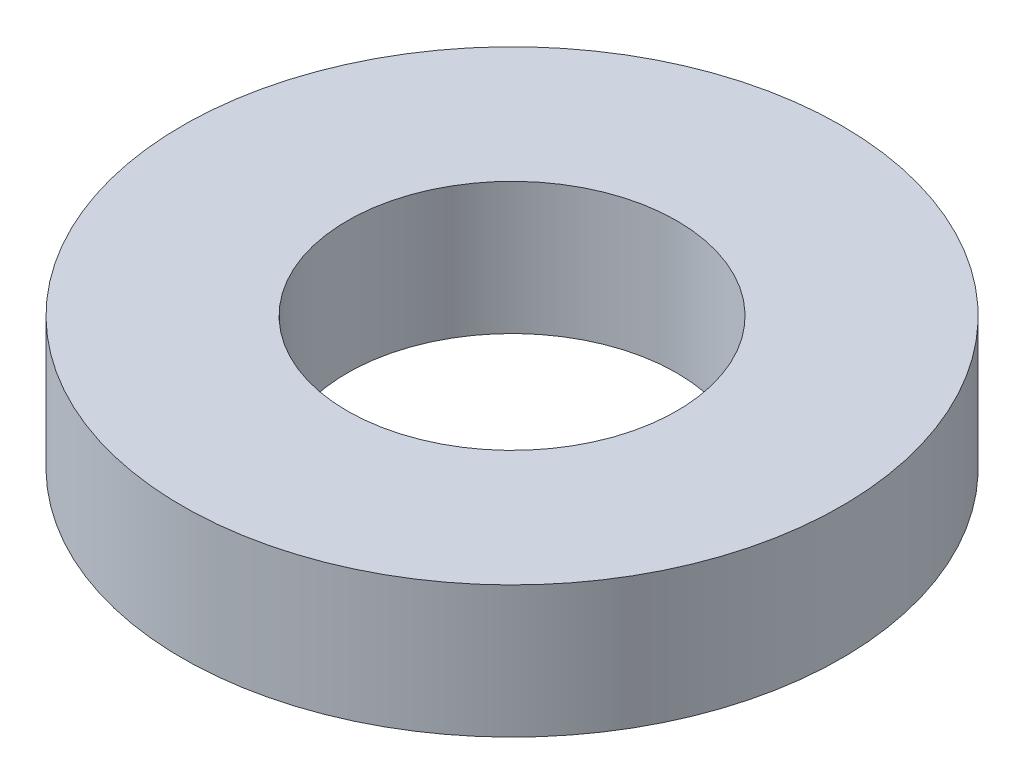
ISO-10303-21;
HEADER;
FILE_DESCRIPTION(('STEP AP214'),'2;1');
FILE_NAME('part.step','',(''),(''),'','','');
FILE_SCHEMA(('AUTOMOTIVE_DESIGN { 1 0 10303 214 1 1 1 1 }'));
ENDSEC;
DATA;
#1=APPLICATION_CONTEXT('core data for automotive mechanical design processes');
#2=APPLICATION_PROTOCOL_DEFINITION('international standard','automotive_design',2000,#1);
#3=PRODUCT_CONTEXT('',#1,'mechanical');
#4=PRODUCT('Part','Part','',(#3));
#5=PRODUCT_RELATED_PRODUCT_CATEGORY('part','',(#4));
#6=PRODUCT_DEFINITION_FORMATION('','',#4);
#7=PRODUCT_DEFINITION_CONTEXT('part definition',#1,'design');
#8=PRODUCT_DEFINITION('design','',#6,#7);
#9=PRODUCT_DEFINITION_SHAPE('','',#8);
#10=(LENGTH_UNIT() NAMED_UNIT(*) SI_UNIT(.MILLI.,.METRE.));
#11=(NAMED_UNIT(*) PLANE_ANGLE_UNIT() SI_UNIT($,.RADIAN.));
#12=(NAMED_UNIT(*) SI_UNIT($,.STERADIAN.) SOLID_ANGLE_UNIT());
#13=UNCERTAINTY_MEASURE_WITH_UNIT(LENGTH_MEASURE(1.E-05),#10,'distance_accuracy_value','');
#14=(GEOMETRIC_REPRESENTATION_CONTEXT(3) GLOBAL_UNCERTAINTY_ASSIGNED_CONTEXT((#13)) GLOBAL_UNIT_ASSIGNED_CONTEXT((#10,
#11,#12)) REPRESENTATION_CONTEXT('',''));
#15=CARTESIAN_POINT('',(0.,0.,0.));
#16=DIRECTION('',(0.,0.,1.));
#17=DIRECTION('',(1.,0.,0.));
#18=AXIS2_PLACEMENT_3D('',#15,#16,#17);
#19=CARTESIAN_POINT('',(0.,0.,0.));
#20=DIRECTION('',(0.,-1.,0.));
#21=DIRECTION('',(0.,0.,-1.));
#22=AXIS2_PLACEMENT_3D('',#19,#20,#21);
#23=CYLINDRICAL_SURFACE('',#22,5.);
#24=CARTESIAN_POINT('',(0.,0.999999999999999,0.));
#25=DIRECTION('',(0.,-1.,0.));
#26=DIRECTION('',(0.,0.,-1.));
#27=AXIS2_PLACEMENT_3D('',#24,#25,#26);
#28=CIRCLE('',#27,5.);
#29=CARTESIAN_POINT('',(0.,0.999999999999999,-5.));
#30=VERTEX_POINT('',#29);
#31=EDGE_CURVE('E10',#30,#30,#28,.T.);
#32=ORIENTED_EDGE('',*,*,#31,.T.);
#33=EDGE_LOOP('',(#32));
#34=FACE_BOUND('',#33,.T.);
#35=CARTESIAN_POINT('',(0.,-1.,0.));
#36=DIRECTION('',(0.,-1.,0.));
#37=DIRECTION('',(0.,0.,-1.));
#38=AXIS2_PLACEMENT_3D('',#35,#36,#37);
#39=CIRCLE('',#38,5.);
#40=CARTESIAN_POINT('',(0.,-1.,-5.));
#41=VERTEX_POINT('',#40);
#42=EDGE_CURVE('E45',#41,#41,#39,.T.);
#43=ORIENTED_EDGE('',*,*,#42,.F.);
#44=EDGE_LOOP('',(#43));
#45=FACE_BOUND('',#44,.T.);
#46=ADVANCED_FACE('F31',(#34,#45),#23,.T.);
#47=CARTESIAN_POINT('',(2.5,0.999999999999999,0.));
#48=DIRECTION('',(0.,1.,0.));
#49=DIRECTION('',(0.,0.,1.));
#50=AXIS2_PLACEMENT_3D('',#47,#48,#49);
#51=PLANE('',#50);
#52=CARTESIAN_POINT('',(0.,1.,0.));
#53=DIRECTION('',(0.,-1.,0.));
#54=DIRECTION('',(0.,0.,-1.));
#55=AXIS2_PLACEMENT_3D('',#52,#53,#54);
#56=CIRCLE('',#55,2.5);
#57=CARTESIAN_POINT('',(0.,1.,-2.5));
#58=VERTEX_POINT('',#57);
#59=EDGE_CURVE('E37',#58,#58,#56,.T.);
#60=ORIENTED_EDGE('',*,*,#59,.T.);
#61=EDGE_LOOP('',(#60));
#62=FACE_BOUND('',#61,.T.);
#63=ORIENTED_EDGE('',*,*,#31,.F.);
#64=EDGE_LOOP('',(#63));
#65=FACE_BOUND('',#64,.T.);
#66=ADVANCED_FACE('F55',(#62,#65),#51,.T.);
#67=CARTESIAN_POINT('',(0.,0.,0.));
#68=DIRECTION('',(0.,-1.,0.));
#69=DIRECTION('',(0.,0.,-1.));
#70=AXIS2_PLACEMENT_3D('',#67,#68,#69);
#71=CYLINDRICAL_SURFACE('',#70,2.5);
#72=CARTESIAN_POINT('',(0.,-1.,0.));
#73=DIRECTION('',(0.,-1.,0.));
#74=DIRECTION('',(0.,0.,-1.));
#75=AXIS2_PLACEMENT_3D('',#72,#73,#74);
#76=CIRCLE('',#75,2.5);
#77=CARTESIAN_POINT('',(0.,-1.,-2.5));
#78=VERTEX_POINT('',#77);
#79=EDGE_CURVE('E41',#78,#78,#76,.T.);
#80=ORIENTED_EDGE('',*,*,#79,.T.);
#81=EDGE_LOOP('',(#80));
#82=FACE_BOUND('',#81,.T.);
#83=ORIENTED_EDGE('',*,*,#59,.F.);
#84=EDGE_LOOP('',(#83));
#85=FACE_BOUND('',#84,.T.);
#86=ADVANCED_FACE('F59',(#82,#85),#71,.F.);
#87=CARTESIAN_POINT('',(2.5,-1.,0.));
#88=DIRECTION('',(0.,-1.,0.));
#89=DIRECTION('',(0.,0.,-1.));
#90=AXIS2_PLACEMENT_3D('',#87,#88,#89);
#91=PLANE('',#90);
#92=ORIENTED_EDGE('',*,*,#42,.T.);
#93=EDGE_LOOP('',(#92));
#94=FACE_BOUND('',#93,.T.);
#95=ORIENTED_EDGE('',*,*,#79,.F.);
#96=EDGE_LOOP('',(#95));
#97=FACE_BOUND('',#96,.T.);
#98=ADVANCED_FACE('F51',(#94,#97),#91,.T.);
#99=CLOSED_SHELL('',(#46,#66,#86,#98));
#100=MANIFOLD_SOLID_BREP('B2',#99);
#101=ADVANCED_BREP_SHAPE_REPRESENTATION('',(#18,#100),#14);
#102=SHAPE_DEFINITION_REPRESENTATION(#9,#101);
ENDSEC;
END-ISO-10303-21;
